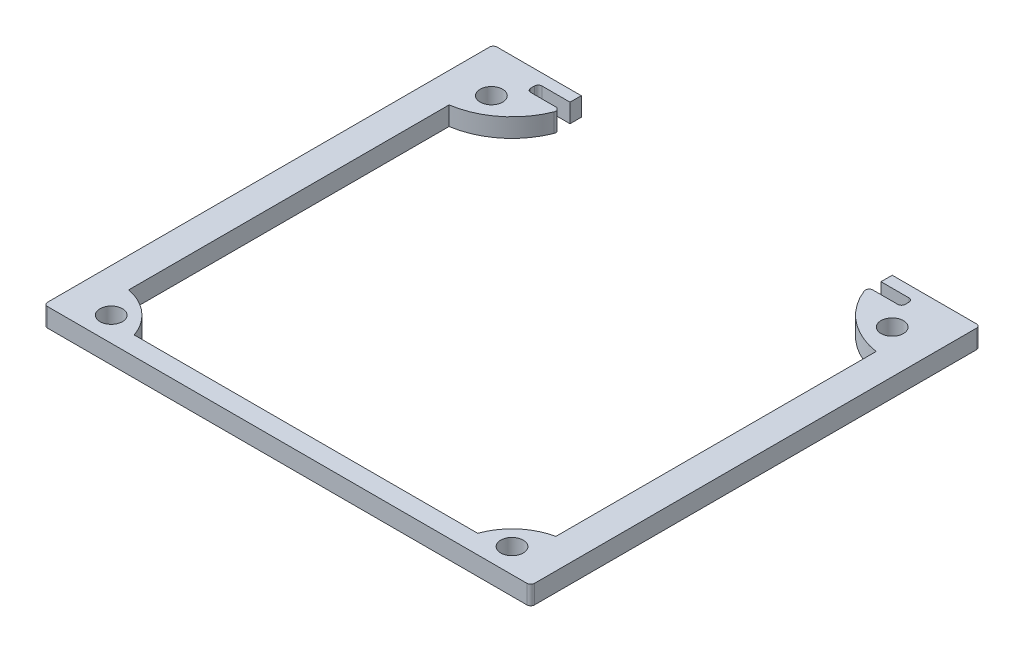
ISO-10303-21;
HEADER;
FILE_DESCRIPTION(('STEP AP214'),'2;1');
FILE_NAME('part.step','',(''),(''),'','','');
FILE_SCHEMA(('AUTOMOTIVE_DESIGN { 1 0 10303 214 1 1 1 1 }'));
ENDSEC;
DATA;
#1=APPLICATION_CONTEXT('core data for automotive mechanical design processes');
#2=APPLICATION_PROTOCOL_DEFINITION('international standard','automotive_design',2000,#1);
#3=PRODUCT_CONTEXT('',#1,'mechanical');
#4=PRODUCT('Part','Part','',(#3));
#5=PRODUCT_RELATED_PRODUCT_CATEGORY('part','',(#4));
#6=PRODUCT_DEFINITION_FORMATION('','',#4);
#7=PRODUCT_DEFINITION_CONTEXT('part definition',#1,'design');
#8=PRODUCT_DEFINITION('design','',#6,#7);
#9=PRODUCT_DEFINITION_SHAPE('','',#8);
#10=(LENGTH_UNIT() NAMED_UNIT(*) SI_UNIT(.MILLI.,.METRE.));
#11=(NAMED_UNIT(*) PLANE_ANGLE_UNIT() SI_UNIT($,.RADIAN.));
#12=(NAMED_UNIT(*) SI_UNIT($,.STERADIAN.) SOLID_ANGLE_UNIT());
#13=UNCERTAINTY_MEASURE_WITH_UNIT(LENGTH_MEASURE(1.E-05),#10,'distance_accuracy_value','');
#14=(GEOMETRIC_REPRESENTATION_CONTEXT(3) GLOBAL_UNCERTAINTY_ASSIGNED_CONTEXT((#13)) GLOBAL_UNIT_ASSIGNED_CONTEXT((#10,
#11,#12)) REPRESENTATION_CONTEXT('',''));
#15=CARTESIAN_POINT('',(0.,0.,0.));
#16=DIRECTION('',(0.,0.,1.));
#17=DIRECTION('',(1.,0.,0.));
#18=AXIS2_PLACEMENT_3D('',#15,#16,#17);
#19=CARTESIAN_POINT('',(125.,5.,-120.));
#20=DIRECTION('',(0.,0.,1.));
#21=DIRECTION('',(1.,0.,0.));
#22=AXIS2_PLACEMENT_3D('',#19,#20,#21);
#23=PLANE('',#22);
#24=DIRECTION('',(-1.,0.,0.));
#25=VECTOR('',#24,1.);
#26=CARTESIAN_POINT('',(125.,0.,-120.));
#27=LINE('',#26,#25);
#28=CARTESIAN_POINT('',(18.4906919245242,0.,-120.));
#29=VERTEX_POINT('',#28);
#30=CARTESIAN_POINT('',(-3.99999999999999,0.,-120.));
#31=VERTEX_POINT('',#30);
#32=EDGE_CURVE('E397',#29,#31,#27,.T.);
#33=ORIENTED_EDGE('',*,*,#32,.T.);
#34=DIRECTION('',(0.,-1.,0.));
#35=VECTOR('',#34,1.);
#36=CARTESIAN_POINT('',(-3.99999999999999,5.,-120.));
#37=LINE('',#36,#35);
#38=CARTESIAN_POINT('',(-3.99999999999999,5.,-120.));
#39=VERTEX_POINT('',#38);
#40=EDGE_CURVE('E11',#31,#39,#37,.F.);
#41=ORIENTED_EDGE('',*,*,#40,.T.);
#42=DIRECTION('',(-1.,0.,0.));
#43=VECTOR('',#42,1.);
#44=CARTESIAN_POINT('',(125.,5.,-120.));
#45=LINE('',#44,#43);
#46=CARTESIAN_POINT('',(18.4906919245242,5.,-120.));
#47=VERTEX_POINT('',#46);
#48=EDGE_CURVE('E405',#47,#39,#45,.T.);
#49=ORIENTED_EDGE('',*,*,#48,.F.);
#50=DIRECTION('',(0.,1.,0.));
#51=VECTOR('',#50,1.);
#52=CARTESIAN_POINT('',(18.4906919245242,-5.,-120.));
#53=LINE('',#52,#51);
#54=EDGE_CURVE('E289',#29,#47,#53,.T.);
#55=ORIENTED_EDGE('',*,*,#54,.F.);
#56=EDGE_LOOP('',(#33,#41,#49,#55));
#57=FACE_BOUND('',#56,.T.);
#58=ADVANCED_FACE('F39',(#57),#23,.F.);
#59=CARTESIAN_POINT('',(9.99999999999999,-5.,-117.));
#60=DIRECTION('',(0.,0.,-1.));
#61=DIRECTION('',(-1.,0.,0.));
#62=AXIS2_PLACEMENT_3D('',#59,#60,#61);
#63=PLANE('',#62);
#64=DIRECTION('',(-1.,0.,0.));
#65=VECTOR('',#64,1.);
#66=CARTESIAN_POINT('',(0.,0.,-117.));
#67=LINE('',#66,#65);
#68=CARTESIAN_POINT('',(18.4906919245242,0.,-117.));
#69=VERTEX_POINT('',#68);
#70=CARTESIAN_POINT('',(11.,0.,-117.));
#71=VERTEX_POINT('',#70);
#72=EDGE_CURVE('E432',#69,#71,#67,.T.);
#73=ORIENTED_EDGE('',*,*,#72,.F.);
#74=DIRECTION('',(0.,1.,0.));
#75=VECTOR('',#74,1.);
#76=CARTESIAN_POINT('',(18.4906919245242,-5.,-117.));
#77=LINE('',#76,#75);
#78=CARTESIAN_POINT('',(18.4906919245242,5.,-117.));
#79=VERTEX_POINT('',#78);
#80=EDGE_CURVE('E303',#69,#79,#77,.T.);
#81=ORIENTED_EDGE('',*,*,#80,.T.);
#82=DIRECTION('',(-1.,0.,0.));
#83=VECTOR('',#82,1.);
#84=CARTESIAN_POINT('',(9.99999999999999,5.,-117.));
#85=LINE('',#84,#83);
#86=CARTESIAN_POINT('',(11.,5.,-117.));
#87=VERTEX_POINT('',#86);
#88=EDGE_CURVE('E324',#79,#87,#85,.T.);
#89=ORIENTED_EDGE('',*,*,#88,.T.);
#90=DIRECTION('',(0.,1.,0.));
#91=VECTOR('',#90,1.);
#92=CARTESIAN_POINT('',(11.,0.,-117.));
#93=LINE('',#92,#91);
#94=EDGE_CURVE('E452',#87,#71,#93,.F.);
#95=ORIENTED_EDGE('',*,*,#94,.T.);
#96=EDGE_LOOP('',(#73,#81,#89,#95));
#97=FACE_BOUND('',#96,.T.);
#98=ADVANCED_FACE('F637',(#97),#63,.F.);
#99=CARTESIAN_POINT('',(0.,5.,0.));
#100=DIRECTION('',(0.,1.,0.));
#101=DIRECTION('',(0.,0.,1.));
#102=AXIS2_PLACEMENT_3D('',#99,#100,#101);
#103=PLANE('',#102);
#104=DIRECTION('',(0.,0.,-1.));
#105=VECTOR('',#104,1.);
#106=CARTESIAN_POINT('',(125.,5.,-120.));
#107=LINE('',#106,#105);
#108=CARTESIAN_POINT('',(125.,5.,-1.));
#109=VERTEX_POINT('',#108);
#110=CARTESIAN_POINT('',(125.,5.,-119.));
#111=VERTEX_POINT('',#110);
#112=EDGE_CURVE('E411',#109,#111,#107,.T.);
#113=ORIENTED_EDGE('',*,*,#112,.T.);
#114=CARTESIAN_POINT('',(124.,5.,-119.));
#115=DIRECTION('',(0.,1.,0.));
#116=DIRECTION('',(0.,0.,1.));
#117=AXIS2_PLACEMENT_3D('',#114,#115,#116);
#118=CIRCLE('',#117,1.);
#119=CARTESIAN_POINT('',(124.,5.,-120.));
#120=VERTEX_POINT('',#119);
#121=EDGE_CURVE('E555',#111,#120,#118,.T.);
#122=ORIENTED_EDGE('',*,*,#121,.T.);
#123=CARTESIAN_POINT('',(101.509308075476,5.,-120.));
#124=VERTEX_POINT('',#123);
#125=EDGE_CURVE('E401',#120,#124,#45,.T.);
#126=ORIENTED_EDGE('',*,*,#125,.T.);
#127=DIRECTION('',(0.,0.,-1.));
#128=VECTOR('',#127,1.);
#129=CARTESIAN_POINT('',(101.509308075476,5.,-113.561951486949));
#130=LINE('',#129,#128);
#131=CARTESIAN_POINT('',(101.509308075476,5.,-117.));
#132=VERTEX_POINT('',#131);
#133=EDGE_CURVE('E281',#132,#124,#130,.T.);
#134=ORIENTED_EDGE('',*,*,#133,.F.);
#135=CARTESIAN_POINT('',(109.,5.,-117.));
#136=VERTEX_POINT('',#135);
#137=EDGE_CURVE('E325',#136,#132,#85,.T.);
#138=ORIENTED_EDGE('',*,*,#137,.F.);
#139=CARTESIAN_POINT('',(109.,5.,-116.));
#140=DIRECTION('',(0.,1.,0.));
#141=DIRECTION('',(0.,0.,1.));
#142=AXIS2_PLACEMENT_3D('',#139,#140,#141);
#143=CIRCLE('',#142,1.);
#144=CARTESIAN_POINT('',(110.,5.,-116.));
#145=VERTEX_POINT('',#144);
#146=EDGE_CURVE('E478',#136,#145,#143,.F.);
#147=ORIENTED_EDGE('',*,*,#146,.T.);
#148=DIRECTION('',(0.,0.,-1.));
#149=VECTOR('',#148,1.);
#150=CARTESIAN_POINT('',(110.,5.,-114.));
#151=LINE('',#150,#149);
#152=CARTESIAN_POINT('',(110.,5.,-115.));
#153=VERTEX_POINT('',#152);
#154=EDGE_CURVE('E320',#153,#145,#151,.T.);
#155=ORIENTED_EDGE('',*,*,#154,.F.);
#156=CARTESIAN_POINT('',(109.,5.,-115.));
#157=DIRECTION('',(0.,1.,0.));
#158=DIRECTION('',(0.,0.,1.));
#159=AXIS2_PLACEMENT_3D('',#156,#157,#158);
#160=CIRCLE('',#159,1.);
#161=CARTESIAN_POINT('',(109.,5.,-114.));
#162=VERTEX_POINT('',#161);
#163=EDGE_CURVE('E484',#153,#162,#160,.F.);
#164=ORIENTED_EDGE('',*,*,#163,.T.);
#165=DIRECTION('',(1.,0.,0.));
#166=VECTOR('',#165,1.);
#167=CARTESIAN_POINT('',(9.99999999999999,5.,-114.));
#168=LINE('',#167,#166);
#169=CARTESIAN_POINT('',(102.336478267344,5.,-114.));
#170=VERTEX_POINT('',#169);
#171=EDGE_CURVE('E315',#170,#162,#168,.T.);
#172=ORIENTED_EDGE('',*,*,#171,.F.);
#173=CARTESIAN_POINT('',(102.336478267344,5.,-113.));
#174=DIRECTION('',(0.,1.,0.));
#175=DIRECTION('',(0.,0.,1.));
#176=AXIS2_PLACEMENT_3D('',#173,#174,#175);
#177=CIRCLE('',#176,1.);
#178=CARTESIAN_POINT('',(101.406819228783,5.,-112.631578947368));
#179=VERTEX_POINT('',#178);
#180=EDGE_CURVE('E246',#170,#179,#177,.T.);
#181=ORIENTED_EDGE('',*,*,#180,.T.);
#182=CARTESIAN_POINT('',(120.,5.,-120.));
#183=DIRECTION('',(0.,-1.,0.));
#184=DIRECTION('',(0.,0.,1.));
#185=AXIS2_PLACEMENT_3D('',#182,#183,#184);
#186=CIRCLE('',#185,20.);
#187=CARTESIAN_POINT('',(117.,5.,-100.226280066715));
#188=VERTEX_POINT('',#187);
#189=EDGE_CURVE('E237',#188,#179,#186,.T.);
#190=ORIENTED_EDGE('',*,*,#189,.F.);
#191=DIRECTION('',(0.,0.,1.));
#192=VECTOR('',#191,1.);
#193=CARTESIAN_POINT('',(117.,5.,-103.567500750222));
#194=LINE('',#193,#192);
#195=CARTESIAN_POINT('',(117.,5.,-14.6969384566991));
#196=VERTEX_POINT('',#195);
#197=EDGE_CURVE('E244',#188,#196,#194,.T.);
#198=ORIENTED_EDGE('',*,*,#197,.T.);
#199=CARTESIAN_POINT('',(120.,5.,0.));
#200=DIRECTION('',(0.,-1.,0.));
#201=DIRECTION('',(0.,0.,-1.));
#202=AXIS2_PLACEMENT_3D('',#199,#200,#201);
#203=CIRCLE('',#202,15.);
#204=CARTESIAN_POINT('',(105.857864376269,5.,-5.));
#205=VERTEX_POINT('',#204);
#206=EDGE_CURVE('E252',#205,#196,#203,.T.);
#207=ORIENTED_EDGE('',*,*,#206,.F.);
#208=DIRECTION('',(1.,0.,0.));
#209=VECTOR('',#208,1.);
#210=CARTESIAN_POINT('',(15.,5.,-5.));
#211=LINE('',#210,#209);
#212=CARTESIAN_POINT('',(14.142135623731,5.,-5.));
#213=VERTEX_POINT('',#212);
#214=EDGE_CURVE('E354',#213,#205,#211,.T.);
#215=ORIENTED_EDGE('',*,*,#214,.F.);
#216=CARTESIAN_POINT('',(0.,5.,0.));
#217=DIRECTION('',(0.,-1.,0.));
#218=DIRECTION('',(0.,0.,1.));
#219=AXIS2_PLACEMENT_3D('',#216,#217,#218);
#220=CIRCLE('',#219,15.);
#221=CARTESIAN_POINT('',(2.97983416543105,5.,-14.7010403831338));
#222=VERTEX_POINT('',#221);
#223=EDGE_CURVE('E351',#222,#213,#220,.T.);
#224=ORIENTED_EDGE('',*,*,#223,.F.);
#225=DIRECTION('',(0.,0.,-1.));
#226=VECTOR('',#225,1.);
#227=CARTESIAN_POINT('',(2.97983416543105,5.,-11.5593706947354));
#228=LINE('',#227,#226);
#229=CARTESIAN_POINT('',(2.97983416543105,5.,-100.223231094374));
#230=VERTEX_POINT('',#229);
#231=EDGE_CURVE('E276',#222,#230,#228,.T.);
#232=ORIENTED_EDGE('',*,*,#231,.T.);
#233=CARTESIAN_POINT('',(0.,5.,-120.));
#234=DIRECTION('',(0.,-1.,0.));
#235=DIRECTION('',(0.,0.,-1.));
#236=AXIS2_PLACEMENT_3D('',#233,#234,#235);
#237=CIRCLE('',#236,20.);
#238=CARTESIAN_POINT('',(18.5931807712165,5.,-112.631578947368));
#239=VERTEX_POINT('',#238);
#240=EDGE_CURVE('E251',#239,#230,#237,.T.);
#241=ORIENTED_EDGE('',*,*,#240,.F.);
#242=CARTESIAN_POINT('',(17.6635217326557,5.,-113.));
#243=DIRECTION('',(0.,1.,0.));
#244=DIRECTION('',(0.,0.,1.));
#245=AXIS2_PLACEMENT_3D('',#242,#243,#244);
#246=CIRCLE('',#245,1.);
#247=CARTESIAN_POINT('',(17.6635217326557,5.,-114.));
#248=VERTEX_POINT('',#247);
#249=EDGE_CURVE('E507',#239,#248,#246,.T.);
#250=ORIENTED_EDGE('',*,*,#249,.T.);
#251=CARTESIAN_POINT('',(11.,5.,-114.));
#252=VERTEX_POINT('',#251);
#253=EDGE_CURVE('E316',#252,#248,#168,.T.);
#254=ORIENTED_EDGE('',*,*,#253,.F.);
#255=CARTESIAN_POINT('',(11.,5.,-115.));
#256=DIRECTION('',(0.,1.,0.));
#257=DIRECTION('',(0.,0.,1.));
#258=AXIS2_PLACEMENT_3D('',#255,#256,#257);
#259=CIRCLE('',#258,1.);
#260=CARTESIAN_POINT('',(9.99999999999999,5.,-115.));
#261=VERTEX_POINT('',#260);
#262=EDGE_CURVE('E491',#252,#261,#259,.F.);
#263=ORIENTED_EDGE('',*,*,#262,.T.);
#264=DIRECTION('',(0.,0.,1.));
#265=VECTOR('',#264,1.);
#266=CARTESIAN_POINT('',(9.99999999999999,5.,-114.));
#267=LINE('',#266,#265);
#268=CARTESIAN_POINT('',(9.99999999999999,5.,-116.));
#269=VERTEX_POINT('',#268);
#270=EDGE_CURVE('E311',#269,#261,#267,.T.);
#271=ORIENTED_EDGE('',*,*,#270,.F.);
#272=CARTESIAN_POINT('',(11.,5.,-116.));
#273=DIRECTION('',(0.,1.,0.));
#274=DIRECTION('',(0.,0.,1.));
#275=AXIS2_PLACEMENT_3D('',#272,#273,#274);
#276=CIRCLE('',#275,1.);
#277=EDGE_CURVE('E471',#269,#87,#276,.F.);
#278=ORIENTED_EDGE('',*,*,#277,.T.);
#279=ORIENTED_EDGE('',*,*,#88,.F.);
#280=DIRECTION('',(0.,0.,1.));
#281=VECTOR('',#280,1.);
#282=CARTESIAN_POINT('',(18.4906919245242,5.,-113.561951486949));
#283=LINE('',#282,#281);
#284=EDGE_CURVE('E285',#47,#79,#283,.T.);
#285=ORIENTED_EDGE('',*,*,#284,.F.);
#286=ORIENTED_EDGE('',*,*,#48,.T.);
#287=CARTESIAN_POINT('',(-4.,5.,-119.));
#288=DIRECTION('',(0.,1.,0.));
#289=DIRECTION('',(0.,0.,1.));
#290=AXIS2_PLACEMENT_3D('',#287,#288,#289);
#291=CIRCLE('',#290,1.);
#292=CARTESIAN_POINT('',(-5.,5.,-119.));
#293=VERTEX_POINT('',#292);
#294=EDGE_CURVE('E549',#39,#293,#291,.T.);
#295=ORIENTED_EDGE('',*,*,#294,.T.);
#296=DIRECTION('',(0.,0.,1.));
#297=VECTOR('',#296,1.);
#298=CARTESIAN_POINT('',(-5.,5.,-120.));
#299=LINE('',#298,#297);
#300=CARTESIAN_POINT('',(-4.99999999999999,5.,-1.));
#301=VERTEX_POINT('',#300);
#302=EDGE_CURVE('E404',#293,#301,#299,.T.);
#303=ORIENTED_EDGE('',*,*,#302,.T.);
#304=CARTESIAN_POINT('',(-3.99999999999999,5.,-1.));
#305=DIRECTION('',(0.,1.,0.));
#306=DIRECTION('',(0.,0.,1.));
#307=AXIS2_PLACEMENT_3D('',#304,#305,#306);
#308=CIRCLE('',#307,1.);
#309=CARTESIAN_POINT('',(-3.99999999999999,5.,0.));
#310=VERTEX_POINT('',#309);
#311=EDGE_CURVE('E62',#301,#310,#308,.T.);
#312=ORIENTED_EDGE('',*,*,#311,.T.);
#313=DIRECTION('',(1.,0.,0.));
#314=VECTOR('',#313,1.);
#315=CARTESIAN_POINT('',(-4.99999999999999,5.,0.));
#316=LINE('',#315,#314);
#317=CARTESIAN_POINT('',(124.,5.,0.));
#318=VERTEX_POINT('',#317);
#319=EDGE_CURVE('E408',#310,#318,#316,.T.);
#320=ORIENTED_EDGE('',*,*,#319,.T.);
#321=CARTESIAN_POINT('',(124.,5.,-1.));
#322=DIRECTION('',(0.,1.,0.));
#323=DIRECTION('',(0.,0.,1.));
#324=AXIS2_PLACEMENT_3D('',#321,#322,#323);
#325=CIRCLE('',#324,1.);
#326=EDGE_CURVE('E552',#318,#109,#325,.T.);
#327=ORIENTED_EDGE('',*,*,#326,.T.);
#328=EDGE_LOOP('',(#113,#122,#126,#134,#138,#147,#155,#164,#172,#181,#190,#198,#207,#215,#224,
#232,#241,#250,#254,#263,#271,#278,#279,#285,#286,#295,#303,#312,#320,#327));
#329=FACE_BOUND('',#328,.T.);
#330=CARTESIAN_POINT('',(6.5,5.,-108.));
#331=DIRECTION('',(0.,1.,0.));
#332=DIRECTION('',(0.,0.,1.));
#333=AXIS2_PLACEMENT_3D('',#330,#331,#332);
#334=CIRCLE('',#333,3.);
#335=CARTESIAN_POINT('',(6.5,5.,-105.));
#336=VERTEX_POINT('',#335);
#337=EDGE_CURVE('E343',#336,#336,#334,.T.);
#338=ORIENTED_EDGE('',*,*,#337,.F.);
#339=EDGE_LOOP('',(#338));
#340=FACE_BOUND('',#339,.T.);
#341=CARTESIAN_POINT('',(6.5,5.,-6.5));
#342=DIRECTION('',(0.,1.,0.));
#343=DIRECTION('',(0.,0.,1.));
#344=AXIS2_PLACEMENT_3D('',#341,#342,#343);
#345=CIRCLE('',#344,3.);
#346=CARTESIAN_POINT('',(6.5,5.,-3.5));
#347=VERTEX_POINT('',#346);
#348=EDGE_CURVE('E393',#347,#347,#345,.T.);
#349=ORIENTED_EDGE('',*,*,#348,.F.);
#350=EDGE_LOOP('',(#349));
#351=FACE_BOUND('',#350,.T.);
#352=CARTESIAN_POINT('',(113.5,5.,-6.5));
#353=DIRECTION('',(0.,1.,0.));
#354=DIRECTION('',(0.,0.,1.));
#355=AXIS2_PLACEMENT_3D('',#352,#353,#354);
#356=CIRCLE('',#355,3.00000000000001);
#357=CARTESIAN_POINT('',(113.5,5.,-3.49999999999999));
#358=VERTEX_POINT('',#357);
#359=EDGE_CURVE('E385',#358,#358,#356,.T.);
#360=ORIENTED_EDGE('',*,*,#359,.F.);
#361=EDGE_LOOP('',(#360));
#362=FACE_BOUND('',#361,.T.);
#363=CARTESIAN_POINT('',(113.5,5.,-108.));
#364=DIRECTION('',(0.,1.,0.));
#365=DIRECTION('',(0.,0.,1.));
#366=AXIS2_PLACEMENT_3D('',#363,#364,#365);
#367=CIRCLE('',#366,3.00000000000001);
#368=CARTESIAN_POINT('',(113.5,5.,-105.));
#369=VERTEX_POINT('',#368);
#370=EDGE_CURVE('E334',#369,#369,#367,.T.);
#371=ORIENTED_EDGE('',*,*,#370,.F.);
#372=EDGE_LOOP('',(#371));
#373=FACE_BOUND('',#372,.T.);
#374=ADVANCED_FACE('F240',(#329,#340,#351,#362,#373),#103,.T.);
#375=CARTESIAN_POINT('',(0.,0.,0.));
#376=DIRECTION('',(0.,1.,0.));
#377=DIRECTION('',(0.,0.,1.));
#378=AXIS2_PLACEMENT_3D('',#375,#376,#377);
#379=PLANE('',#378);
#380=CARTESIAN_POINT('',(124.,0.,-120.));
#381=VERTEX_POINT('',#380);
#382=CARTESIAN_POINT('',(101.509308075476,0.,-120.));
#383=VERTEX_POINT('',#382);
#384=EDGE_CURVE('E415',#381,#383,#27,.T.);
#385=ORIENTED_EDGE('',*,*,#384,.F.);
#386=CARTESIAN_POINT('',(124.,0.,-119.));
#387=DIRECTION('',(0.,1.,0.));
#388=DIRECTION('',(0.,0.,1.));
#389=AXIS2_PLACEMENT_3D('',#386,#387,#388);
#390=CIRCLE('',#389,1.);
#391=CARTESIAN_POINT('',(125.,0.,-119.));
#392=VERTEX_POINT('',#391);
#393=EDGE_CURVE('E537',#381,#392,#390,.F.);
#394=ORIENTED_EDGE('',*,*,#393,.T.);
#395=DIRECTION('',(0.,0.,-1.));
#396=VECTOR('',#395,1.);
#397=CARTESIAN_POINT('',(125.,0.,-120.));
#398=LINE('',#397,#396);
#399=CARTESIAN_POINT('',(125.,0.,-1.));
#400=VERTEX_POINT('',#399);
#401=EDGE_CURVE('E425',#400,#392,#398,.T.);
#402=ORIENTED_EDGE('',*,*,#401,.F.);
#403=CARTESIAN_POINT('',(124.,0.,-1.));
#404=DIRECTION('',(0.,1.,0.));
#405=DIRECTION('',(0.,0.,1.));
#406=AXIS2_PLACEMENT_3D('',#403,#404,#405);
#407=CIRCLE('',#406,1.);
#408=CARTESIAN_POINT('',(124.,0.,0.));
#409=VERTEX_POINT('',#408);
#410=EDGE_CURVE('E534',#400,#409,#407,.F.);
#411=ORIENTED_EDGE('',*,*,#410,.T.);
#412=DIRECTION('',(1.,0.,0.));
#413=VECTOR('',#412,1.);
#414=CARTESIAN_POINT('',(-4.99999999999999,0.,0.));
#415=LINE('',#414,#413);
#416=CARTESIAN_POINT('',(-3.99999999999999,0.,0.));
#417=VERTEX_POINT('',#416);
#418=EDGE_CURVE('E422',#417,#409,#415,.T.);
#419=ORIENTED_EDGE('',*,*,#418,.F.);
#420=CARTESIAN_POINT('',(-3.99999999999999,0.,-1.));
#421=DIRECTION('',(0.,1.,0.));
#422=DIRECTION('',(0.,0.,1.));
#423=AXIS2_PLACEMENT_3D('',#420,#421,#422);
#424=CIRCLE('',#423,1.);
#425=CARTESIAN_POINT('',(-4.99999999999999,0.,-1.));
#426=VERTEX_POINT('',#425);
#427=EDGE_CURVE('E528',#417,#426,#424,.F.);
#428=ORIENTED_EDGE('',*,*,#427,.T.);
#429=DIRECTION('',(0.,0.,1.));
#430=VECTOR('',#429,1.);
#431=CARTESIAN_POINT('',(-5.,0.,-120.));
#432=LINE('',#431,#430);
#433=CARTESIAN_POINT('',(-5.,0.,-119.));
#434=VERTEX_POINT('',#433);
#435=EDGE_CURVE('E418',#434,#426,#432,.T.);
#436=ORIENTED_EDGE('',*,*,#435,.F.);
#437=CARTESIAN_POINT('',(-4.,0.,-119.));
#438=DIRECTION('',(0.,1.,0.));
#439=DIRECTION('',(0.,0.,1.));
#440=AXIS2_PLACEMENT_3D('',#437,#438,#439);
#441=CIRCLE('',#440,1.);
#442=EDGE_CURVE('E531',#434,#31,#441,.F.);
#443=ORIENTED_EDGE('',*,*,#442,.T.);
#444=ORIENTED_EDGE('',*,*,#32,.F.);
#445=DIRECTION('',(0.,0.,1.));
#446=VECTOR('',#445,1.);
#447=CARTESIAN_POINT('',(18.4906919245243,0.,0.));
#448=LINE('',#447,#446);
#449=EDGE_CURVE('E307',#29,#69,#448,.T.);
#450=ORIENTED_EDGE('',*,*,#449,.T.);
#451=ORIENTED_EDGE('',*,*,#72,.T.);
#452=CARTESIAN_POINT('',(11.,0.,-116.));
#453=DIRECTION('',(0.,1.,0.));
#454=DIRECTION('',(0.,0.,1.));
#455=AXIS2_PLACEMENT_3D('',#452,#453,#454);
#456=CIRCLE('',#455,1.);
#457=CARTESIAN_POINT('',(9.99999999999999,0.,-116.));
#458=VERTEX_POINT('',#457);
#459=EDGE_CURVE('E475',#71,#458,#456,.T.);
#460=ORIENTED_EDGE('',*,*,#459,.T.);
#461=DIRECTION('',(0.,0.,1.));
#462=VECTOR('',#461,1.);
#463=CARTESIAN_POINT('',(9.99999999999999,0.,0.));
#464=LINE('',#463,#462);
#465=CARTESIAN_POINT('',(9.99999999999999,0.,-115.));
#466=VERTEX_POINT('',#465);
#467=EDGE_CURVE('E437',#458,#466,#464,.T.);
#468=ORIENTED_EDGE('',*,*,#467,.T.);
#469=CARTESIAN_POINT('',(11.,0.,-115.));
#470=DIRECTION('',(0.,1.,0.));
#471=DIRECTION('',(0.,0.,1.));
#472=AXIS2_PLACEMENT_3D('',#469,#470,#471);
#473=CIRCLE('',#472,1.);
#474=CARTESIAN_POINT('',(11.,0.,-114.));
#475=VERTEX_POINT('',#474);
#476=EDGE_CURVE('E494',#466,#475,#473,.T.);
#477=ORIENTED_EDGE('',*,*,#476,.T.);
#478=DIRECTION('',(1.,0.,0.));
#479=VECTOR('',#478,1.);
#480=CARTESIAN_POINT('',(0.,0.,-114.));
#481=LINE('',#480,#479);
#482=CARTESIAN_POINT('',(17.6635217326557,0.,-114.));
#483=VERTEX_POINT('',#482);
#484=EDGE_CURVE('E329',#475,#483,#481,.T.);
#485=ORIENTED_EDGE('',*,*,#484,.T.);
#486=CARTESIAN_POINT('',(17.6635217326557,0.,-113.));
#487=DIRECTION('',(0.,1.,0.));
#488=DIRECTION('',(0.,0.,1.));
#489=AXIS2_PLACEMENT_3D('',#486,#487,#488);
#490=CIRCLE('',#489,1.);
#491=CARTESIAN_POINT('',(18.5931807712165,0.,-112.631578947368));
#492=VERTEX_POINT('',#491);
#493=EDGE_CURVE('E501',#483,#492,#490,.F.);
#494=ORIENTED_EDGE('',*,*,#493,.T.);
#495=CARTESIAN_POINT('',(0.,0.,-120.));
#496=DIRECTION('',(0.,-1.,0.));
#497=DIRECTION('',(0.,0.,-1.));
#498=AXIS2_PLACEMENT_3D('',#495,#496,#497);
#499=CIRCLE('',#498,20.);
#500=CARTESIAN_POINT('',(2.97983416543105,0.,-100.223231094374));
#501=VERTEX_POINT('',#500);
#502=EDGE_CURVE('E355',#492,#501,#499,.T.);
#503=ORIENTED_EDGE('',*,*,#502,.T.);
#504=DIRECTION('',(0.,0.,-1.));
#505=VECTOR('',#504,1.);
#506=CARTESIAN_POINT('',(2.97983416543105,0.,-11.5593706947354));
#507=LINE('',#506,#505);
#508=CARTESIAN_POINT('',(2.97983416543105,0.,-14.7010403831338));
#509=VERTEX_POINT('',#508);
#510=EDGE_CURVE('E670',#509,#501,#507,.T.);
#511=ORIENTED_EDGE('',*,*,#510,.F.);
#512=CARTESIAN_POINT('',(0.,0.,0.));
#513=DIRECTION('',(0.,-1.,0.));
#514=DIRECTION('',(0.,0.,1.));
#515=AXIS2_PLACEMENT_3D('',#512,#513,#514);
#516=CIRCLE('',#515,15.);
#517=CARTESIAN_POINT('',(14.142135623731,0.,-5.));
#518=VERTEX_POINT('',#517);
#519=EDGE_CURVE('E347',#509,#518,#516,.T.);
#520=ORIENTED_EDGE('',*,*,#519,.T.);
#521=DIRECTION('',(1.,0.,0.));
#522=VECTOR('',#521,1.);
#523=CARTESIAN_POINT('',(105.,0.,-5.));
#524=LINE('',#523,#522);
#525=CARTESIAN_POINT('',(105.857864376269,0.,-5.));
#526=VERTEX_POINT('',#525);
#527=EDGE_CURVE('E365',#518,#526,#524,.T.);
#528=ORIENTED_EDGE('',*,*,#527,.T.);
#529=CARTESIAN_POINT('',(120.,0.,0.));
#530=DIRECTION('',(0.,-1.,0.));
#531=DIRECTION('',(0.,0.,-1.));
#532=AXIS2_PLACEMENT_3D('',#529,#530,#531);
#533=CIRCLE('',#532,15.);
#534=CARTESIAN_POINT('',(117.,0.,-14.6969384566991));
#535=VERTEX_POINT('',#534);
#536=EDGE_CURVE('E369',#526,#535,#533,.T.);
#537=ORIENTED_EDGE('',*,*,#536,.T.);
#538=DIRECTION('',(0.,0.,1.));
#539=VECTOR('',#538,1.);
#540=CARTESIAN_POINT('',(117.,0.,-103.567500750222));
#541=LINE('',#540,#539);
#542=CARTESIAN_POINT('',(117.,0.,-100.226280066715));
#543=VERTEX_POINT('',#542);
#544=EDGE_CURVE('E269',#543,#535,#541,.T.);
#545=ORIENTED_EDGE('',*,*,#544,.F.);
#546=CARTESIAN_POINT('',(120.,0.,-120.));
#547=DIRECTION('',(0.,-1.,0.));
#548=DIRECTION('',(0.,0.,1.));
#549=AXIS2_PLACEMENT_3D('',#546,#547,#548);
#550=CIRCLE('',#549,20.);
#551=CARTESIAN_POINT('',(101.406819228783,0.,-112.631578947368));
#552=VERTEX_POINT('',#551);
#553=EDGE_CURVE('E257',#543,#552,#550,.T.);
#554=ORIENTED_EDGE('',*,*,#553,.T.);
#555=CARTESIAN_POINT('',(102.336478267344,0.,-113.));
#556=DIRECTION('',(0.,1.,0.));
#557=DIRECTION('',(0.,0.,1.));
#558=AXIS2_PLACEMENT_3D('',#555,#556,#557);
#559=CIRCLE('',#558,1.);
#560=CARTESIAN_POINT('',(102.336478267344,0.,-114.));
#561=VERTEX_POINT('',#560);
#562=EDGE_CURVE('E263',#552,#561,#559,.F.);
#563=ORIENTED_EDGE('',*,*,#562,.T.);
#564=CARTESIAN_POINT('',(109.,0.,-114.));
#565=VERTEX_POINT('',#564);
#566=EDGE_CURVE('E333',#561,#565,#481,.T.);
#567=ORIENTED_EDGE('',*,*,#566,.T.);
#568=CARTESIAN_POINT('',(109.,0.,-115.));
#569=DIRECTION('',(0.,1.,0.));
#570=DIRECTION('',(0.,0.,1.));
#571=AXIS2_PLACEMENT_3D('',#568,#569,#570);
#572=CIRCLE('',#571,1.);
#573=CARTESIAN_POINT('',(110.,0.,-115.));
#574=VERTEX_POINT('',#573);
#575=EDGE_CURVE('E488',#565,#574,#572,.T.);
#576=ORIENTED_EDGE('',*,*,#575,.T.);
#577=DIRECTION('',(0.,0.,-1.));
#578=VECTOR('',#577,1.);
#579=CARTESIAN_POINT('',(110.,0.,0.));
#580=LINE('',#579,#578);
#581=CARTESIAN_POINT('',(110.,0.,-116.));
#582=VERTEX_POINT('',#581);
#583=EDGE_CURVE('E414',#574,#582,#580,.T.);
#584=ORIENTED_EDGE('',*,*,#583,.T.);
#585=CARTESIAN_POINT('',(109.,0.,-116.));
#586=DIRECTION('',(0.,1.,0.));
#587=DIRECTION('',(0.,0.,1.));
#588=AXIS2_PLACEMENT_3D('',#585,#586,#587);
#589=CIRCLE('',#588,1.);
#590=CARTESIAN_POINT('',(109.,0.,-117.));
#591=VERTEX_POINT('',#590);
#592=EDGE_CURVE('E481',#582,#591,#589,.T.);
#593=ORIENTED_EDGE('',*,*,#592,.T.);
#594=CARTESIAN_POINT('',(101.509308075476,0.,-117.));
#595=VERTEX_POINT('',#594);
#596=EDGE_CURVE('E433',#591,#595,#67,.T.);
#597=ORIENTED_EDGE('',*,*,#596,.T.);
#598=DIRECTION('',(0.,0.,-1.));
#599=VECTOR('',#598,1.);
#600=CARTESIAN_POINT('',(101.509308075476,0.,0.));
#601=LINE('',#600,#599);
#602=EDGE_CURVE('E299',#595,#383,#601,.T.);
#603=ORIENTED_EDGE('',*,*,#602,.T.);
#604=EDGE_LOOP('',(#385,#394,#402,#411,#419,#428,#436,#443,#444,#450,#451,#460,#468,#477,#485,
#494,#503,#511,#520,#528,#537,#545,#554,#563,#567,#576,#584,#593,#597,#603));
#605=FACE_BOUND('',#604,.T.);
#606=CARTESIAN_POINT('',(113.5,0.,-6.5));
#607=DIRECTION('',(0.,1.,0.));
#608=DIRECTION('',(0.,0.,1.));
#609=AXIS2_PLACEMENT_3D('',#606,#607,#608);
#610=CIRCLE('',#609,3.00000000000001);
#611=CARTESIAN_POINT('',(113.5,0.,-3.49999999999999));
#612=VERTEX_POINT('',#611);
#613=EDGE_CURVE('E384',#612,#612,#610,.T.);
#614=ORIENTED_EDGE('',*,*,#613,.T.);
#615=EDGE_LOOP('',(#614));
#616=FACE_BOUND('',#615,.T.);
#617=CARTESIAN_POINT('',(6.5,0.,-6.5));
#618=DIRECTION('',(0.,1.,0.));
#619=DIRECTION('',(0.,0.,1.));
#620=AXIS2_PLACEMENT_3D('',#617,#618,#619);
#621=CIRCLE('',#620,3.);
#622=CARTESIAN_POINT('',(6.5,0.,-3.5));
#623=VERTEX_POINT('',#622);
#624=EDGE_CURVE('E389',#623,#623,#621,.T.);
#625=ORIENTED_EDGE('',*,*,#624,.T.);
#626=EDGE_LOOP('',(#625));
#627=FACE_BOUND('',#626,.T.);
#628=CARTESIAN_POINT('',(6.5,0.,-108.));
#629=DIRECTION('',(0.,1.,0.));
#630=DIRECTION('',(0.,0.,1.));
#631=AXIS2_PLACEMENT_3D('',#628,#629,#630);
#632=CIRCLE('',#631,3.);
#633=CARTESIAN_POINT('',(6.5,0.,-105.));
#634=VERTEX_POINT('',#633);
#635=EDGE_CURVE('E338',#634,#634,#632,.T.);
#636=ORIENTED_EDGE('',*,*,#635,.T.);
#637=EDGE_LOOP('',(#636));
#638=FACE_BOUND('',#637,.T.);
#639=CARTESIAN_POINT('',(113.5,0.,-108.));
#640=DIRECTION('',(0.,1.,0.));
#641=DIRECTION('',(0.,0.,1.));
#642=AXIS2_PLACEMENT_3D('',#639,#640,#641);
#643=CIRCLE('',#642,3.00000000000001);
#644=CARTESIAN_POINT('',(113.5,0.,-105.));
#645=VERTEX_POINT('',#644);
#646=EDGE_CURVE('E339',#645,#645,#643,.T.);
#647=ORIENTED_EDGE('',*,*,#646,.T.);
#648=EDGE_LOOP('',(#647));
#649=FACE_BOUND('',#648,.T.);
#650=ADVANCED_FACE('F578',(#605,#616,#627,#638,#649),#379,.F.);
#651=ORIENTED_EDGE('',*,*,#125,.F.);
#652=DIRECTION('',(0.,-1.,0.));
#653=VECTOR('',#652,1.);
#654=CARTESIAN_POINT('',(124.,5.,-120.));
#655=LINE('',#654,#653);
#656=EDGE_CURVE('E524',#120,#381,#655,.T.);
#657=ORIENTED_EDGE('',*,*,#656,.T.);
#658=ORIENTED_EDGE('',*,*,#384,.T.);
#659=DIRECTION('',(0.,1.,0.));
#660=VECTOR('',#659,1.);
#661=CARTESIAN_POINT('',(101.509308075476,-5.,-120.));
#662=LINE('',#661,#660);
#663=EDGE_CURVE('E288',#383,#124,#662,.T.);
#664=ORIENTED_EDGE('',*,*,#663,.T.);
#665=EDGE_LOOP('',(#651,#657,#658,#664));
#666=FACE_BOUND('',#665,.T.);
#667=ADVANCED_FACE('F601',(#666),#23,.F.);
#668=CARTESIAN_POINT('',(-5.,5.,-120.));
#669=DIRECTION('',(1.,0.,0.));
#670=DIRECTION('',(0.,0.,-1.));
#671=AXIS2_PLACEMENT_3D('',#668,#669,#670);
#672=PLANE('',#671);
#673=ORIENTED_EDGE('',*,*,#302,.F.);
#674=DIRECTION('',(0.,-1.,0.));
#675=VECTOR('',#674,1.);
#676=CARTESIAN_POINT('',(-5.,5.,-119.));
#677=LINE('',#676,#675);
#678=EDGE_CURVE('E48',#293,#434,#677,.T.);
#679=ORIENTED_EDGE('',*,*,#678,.T.);
#680=ORIENTED_EDGE('',*,*,#435,.T.);
#681=DIRECTION('',(0.,-1.,0.));
#682=VECTOR('',#681,1.);
#683=CARTESIAN_POINT('',(-4.99999999999999,5.,-1.));
#684=LINE('',#683,#682);
#685=EDGE_CURVE('E564',#426,#301,#684,.F.);
#686=ORIENTED_EDGE('',*,*,#685,.T.);
#687=EDGE_LOOP('',(#673,#679,#680,#686));
#688=FACE_BOUND('',#687,.T.);
#689=ADVANCED_FACE('F572',(#688),#672,.F.);
#690=CARTESIAN_POINT('',(-4.99999999999999,5.,0.));
#691=DIRECTION('',(0.,0.,-1.));
#692=DIRECTION('',(-1.,0.,0.));
#693=AXIS2_PLACEMENT_3D('',#690,#691,#692);
#694=PLANE('',#693);
#695=ORIENTED_EDGE('',*,*,#418,.T.);
#696=DIRECTION('',(0.,-1.,0.));
#697=VECTOR('',#696,1.);
#698=CARTESIAN_POINT('',(124.,5.,0.));
#699=LINE('',#698,#697);
#700=EDGE_CURVE('E55',#409,#318,#699,.F.);
#701=ORIENTED_EDGE('',*,*,#700,.T.);
#702=ORIENTED_EDGE('',*,*,#319,.F.);
#703=DIRECTION('',(0.,-1.,0.));
#704=VECTOR('',#703,1.);
#705=CARTESIAN_POINT('',(-3.99999999999999,5.,0.));
#706=LINE('',#705,#704);
#707=EDGE_CURVE('E558',#310,#417,#706,.T.);
#708=ORIENTED_EDGE('',*,*,#707,.T.);
#709=EDGE_LOOP('',(#695,#701,#702,#708));
#710=FACE_BOUND('',#709,.T.);
#711=ADVANCED_FACE('F585',(#710),#694,.F.);
#712=CARTESIAN_POINT('',(125.,5.,-120.));
#713=DIRECTION('',(-1.,0.,0.));
#714=DIRECTION('',(0.,0.,1.));
#715=AXIS2_PLACEMENT_3D('',#712,#713,#714);
#716=PLANE('',#715);
#717=ORIENTED_EDGE('',*,*,#401,.T.);
#718=DIRECTION('',(0.,-1.,0.));
#719=VECTOR('',#718,1.);
#720=CARTESIAN_POINT('',(125.,5.,-119.));
#721=LINE('',#720,#719);
#722=EDGE_CURVE('E544',#392,#111,#721,.F.);
#723=ORIENTED_EDGE('',*,*,#722,.T.);
#724=ORIENTED_EDGE('',*,*,#112,.F.);
#725=DIRECTION('',(0.,-1.,0.));
#726=VECTOR('',#725,1.);
#727=CARTESIAN_POINT('',(125.,5.,-1.));
#728=LINE('',#727,#726);
#729=EDGE_CURVE('E540',#109,#400,#728,.T.);
#730=ORIENTED_EDGE('',*,*,#729,.T.);
#731=EDGE_LOOP('',(#717,#723,#724,#730));
#732=FACE_BOUND('',#731,.T.);
#733=ADVANCED_FACE('F593',(#732),#716,.F.);
#734=CARTESIAN_POINT('',(6.5,5.,-6.5));
#735=DIRECTION('',(0.,-1.,0.));
#736=DIRECTION('',(0.,0.,-1.));
#737=AXIS2_PLACEMENT_3D('',#734,#735,#736);
#738=CYLINDRICAL_SURFACE('',#737,3.);
#739=ORIENTED_EDGE('',*,*,#348,.T.);
#740=EDGE_LOOP('',(#739));
#741=FACE_BOUND('',#740,.T.);
#742=ORIENTED_EDGE('',*,*,#624,.F.);
#743=EDGE_LOOP('',(#742));
#744=FACE_BOUND('',#743,.T.);
#745=ADVANCED_FACE('F723',(#741,#744),#738,.F.);
#746=CARTESIAN_POINT('',(113.5,5.,-6.5));
#747=DIRECTION('',(0.,-1.,0.));
#748=DIRECTION('',(0.,0.,-1.));
#749=AXIS2_PLACEMENT_3D('',#746,#747,#748);
#750=CYLINDRICAL_SURFACE('',#749,3.00000000000001);
#751=ORIENTED_EDGE('',*,*,#359,.T.);
#752=EDGE_LOOP('',(#751));
#753=FACE_BOUND('',#752,.T.);
#754=ORIENTED_EDGE('',*,*,#613,.F.);
#755=EDGE_LOOP('',(#754));
#756=FACE_BOUND('',#755,.T.);
#757=ADVANCED_FACE('F740',(#753,#756),#750,.F.);
#758=CARTESIAN_POINT('',(0.,5.,0.));
#759=DIRECTION('',(0.,-1.,0.));
#760=DIRECTION('',(0.,0.,-1.));
#761=AXIS2_PLACEMENT_3D('',#758,#759,#760);
#762=CYLINDRICAL_SURFACE('',#761,15.);
#763=DIRECTION('',(0.,-1.,0.));
#764=VECTOR('',#763,1.);
#765=CARTESIAN_POINT('',(2.97983416543105,5.,-14.7010403831338));
#766=LINE('',#765,#764);
#767=EDGE_CURVE('E270',#222,#509,#766,.T.);
#768=ORIENTED_EDGE('',*,*,#767,.F.);
#769=ORIENTED_EDGE('',*,*,#223,.T.);
#770=DIRECTION('',(0.,-1.,0.));
#771=VECTOR('',#770,1.);
#772=CARTESIAN_POINT('',(14.142135623731,5.,-5.));
#773=LINE('',#772,#771);
#774=EDGE_CURVE('E380',#213,#518,#773,.T.);
#775=ORIENTED_EDGE('',*,*,#774,.T.);
#776=ORIENTED_EDGE('',*,*,#519,.F.);
#777=EDGE_LOOP('',(#768,#769,#775,#776));
#778=FACE_BOUND('',#777,.T.);
#779=ADVANCED_FACE('F683',(#778),#762,.T.);
#780=CARTESIAN_POINT('',(105.,5.,-5.));
#781=DIRECTION('',(0.,0.,-1.));
#782=DIRECTION('',(-1.,0.,0.));
#783=AXIS2_PLACEMENT_3D('',#780,#781,#782);
#784=PLANE('',#783);
#785=ORIENTED_EDGE('',*,*,#527,.F.);
#786=ORIENTED_EDGE('',*,*,#774,.F.);
#787=ORIENTED_EDGE('',*,*,#214,.T.);
#788=DIRECTION('',(0.,-1.,0.));
#789=VECTOR('',#788,1.);
#790=CARTESIAN_POINT('',(105.857864376269,5.,-5.));
#791=LINE('',#790,#789);
#792=EDGE_CURVE('E362',#205,#526,#791,.T.);
#793=ORIENTED_EDGE('',*,*,#792,.T.);
#794=EDGE_LOOP('',(#785,#786,#787,#793));
#795=FACE_BOUND('',#794,.T.);
#796=ADVANCED_FACE('F679',(#795),#784,.T.);
#797=CARTESIAN_POINT('',(120.,5.,0.));
#798=DIRECTION('',(0.,-1.,0.));
#799=DIRECTION('',(0.,0.,-1.));
#800=AXIS2_PLACEMENT_3D('',#797,#798,#799);
#801=CYLINDRICAL_SURFACE('',#800,15.);
#802=DIRECTION('',(0.,-1.,0.));
#803=VECTOR('',#802,1.);
#804=CARTESIAN_POINT('',(117.,5.,-14.6969384566991));
#805=LINE('',#804,#803);
#806=EDGE_CURVE('E267',#535,#196,#805,.F.);
#807=ORIENTED_EDGE('',*,*,#806,.F.);
#808=ORIENTED_EDGE('',*,*,#536,.F.);
#809=ORIENTED_EDGE('',*,*,#792,.F.);
#810=ORIENTED_EDGE('',*,*,#206,.T.);
#811=EDGE_LOOP('',(#807,#808,#809,#810));
#812=FACE_BOUND('',#811,.T.);
#813=ADVANCED_FACE('F685',(#812),#801,.T.);
#814=CARTESIAN_POINT('',(120.,5.,-120.));
#815=DIRECTION('',(0.,-1.,0.));
#816=DIRECTION('',(0.,0.,-1.));
#817=AXIS2_PLACEMENT_3D('',#814,#815,#816);
#818=CYLINDRICAL_SURFACE('',#817,20.);
#819=DIRECTION('',(0.,-1.,0.));
#820=VECTOR('',#819,1.);
#821=CARTESIAN_POINT('',(117.,5.,-100.226280066715));
#822=LINE('',#821,#820);
#823=EDGE_CURVE('E255',#188,#543,#822,.T.);
#824=ORIENTED_EDGE('',*,*,#823,.F.);
#825=ORIENTED_EDGE('',*,*,#189,.T.);
#826=DIRECTION('',(0.,-1.,0.));
#827=VECTOR('',#826,1.);
#828=CARTESIAN_POINT('',(101.406819228783,5.,-112.631578947368));
#829=LINE('',#828,#827);
#830=EDGE_CURVE('E516',#179,#552,#829,.T.);
#831=ORIENTED_EDGE('',*,*,#830,.T.);
#832=ORIENTED_EDGE('',*,*,#553,.F.);
#833=EDGE_LOOP('',(#824,#825,#831,#832));
#834=FACE_BOUND('',#833,.T.);
#835=ADVANCED_FACE('F256',(#834),#818,.T.);
#836=CARTESIAN_POINT('',(0.,5.,-120.));
#837=DIRECTION('',(0.,-1.,0.));
#838=DIRECTION('',(0.,0.,-1.));
#839=AXIS2_PLACEMENT_3D('',#836,#837,#838);
#840=CYLINDRICAL_SURFACE('',#839,20.);
#841=DIRECTION('',(0.,-1.,0.));
#842=VECTOR('',#841,1.);
#843=CARTESIAN_POINT('',(2.97983416543105,5.,-100.223231094374));
#844=LINE('',#843,#842);
#845=EDGE_CURVE('E262',#501,#230,#844,.F.);
#846=ORIENTED_EDGE('',*,*,#845,.F.);
#847=ORIENTED_EDGE('',*,*,#502,.F.);
#848=DIRECTION('',(0.,-1.,0.));
#849=VECTOR('',#848,1.);
#850=CARTESIAN_POINT('',(18.5931807712165,5.,-112.631578947368));
#851=LINE('',#850,#849);
#852=EDGE_CURVE('E504',#492,#239,#851,.F.);
#853=ORIENTED_EDGE('',*,*,#852,.T.);
#854=ORIENTED_EDGE('',*,*,#240,.T.);
#855=EDGE_LOOP('',(#846,#847,#853,#854));
#856=FACE_BOUND('',#855,.T.);
#857=ADVANCED_FACE('F661',(#856),#840,.T.);
#858=CARTESIAN_POINT('',(6.5,5.,-108.));
#859=DIRECTION('',(0.,-1.,0.));
#860=DIRECTION('',(0.,0.,-1.));
#861=AXIS2_PLACEMENT_3D('',#858,#859,#860);
#862=CYLINDRICAL_SURFACE('',#861,3.);
#863=ORIENTED_EDGE('',*,*,#337,.T.);
#864=EDGE_LOOP('',(#863));
#865=FACE_BOUND('',#864,.T.);
#866=ORIENTED_EDGE('',*,*,#635,.F.);
#867=EDGE_LOOP('',(#866));
#868=FACE_BOUND('',#867,.T.);
#869=ADVANCED_FACE('F780',(#865,#868),#862,.F.);
#870=CARTESIAN_POINT('',(113.5,5.,-108.));
#871=DIRECTION('',(0.,-1.,0.));
#872=DIRECTION('',(0.,0.,-1.));
#873=AXIS2_PLACEMENT_3D('',#870,#871,#872);
#874=CYLINDRICAL_SURFACE('',#873,3.00000000000001);
#875=ORIENTED_EDGE('',*,*,#370,.T.);
#876=EDGE_LOOP('',(#875));
#877=FACE_BOUND('',#876,.T.);
#878=ORIENTED_EDGE('',*,*,#646,.F.);
#879=EDGE_LOOP('',(#878));
#880=FACE_BOUND('',#879,.T.);
#881=ADVANCED_FACE('F787',(#877,#880),#874,.F.);
#882=CARTESIAN_POINT('',(9.99999999999999,-5.,-114.));
#883=DIRECTION('',(-1.,0.,0.));
#884=DIRECTION('',(0.,0.,1.));
#885=AXIS2_PLACEMENT_3D('',#882,#883,#884);
#886=PLANE('',#885);
#887=ORIENTED_EDGE('',*,*,#467,.F.);
#888=DIRECTION('',(0.,1.,0.));
#889=VECTOR('',#888,1.);
#890=CARTESIAN_POINT('',(9.99999999999999,5.,-116.));
#891=LINE('',#890,#889);
#892=EDGE_CURVE('E444',#458,#269,#891,.T.);
#893=ORIENTED_EDGE('',*,*,#892,.T.);
#894=ORIENTED_EDGE('',*,*,#270,.T.);
#895=DIRECTION('',(0.,1.,0.));
#896=VECTOR('',#895,1.);
#897=CARTESIAN_POINT('',(9.99999999999999,0.,-115.));
#898=LINE('',#897,#896);
#899=EDGE_CURVE('E441',#261,#466,#898,.F.);
#900=ORIENTED_EDGE('',*,*,#899,.T.);
#901=EDGE_LOOP('',(#887,#893,#894,#900));
#902=FACE_BOUND('',#901,.T.);
#903=ADVANCED_FACE('F644',(#902),#886,.F.);
#904=ORIENTED_EDGE('',*,*,#137,.T.);
#905=DIRECTION('',(0.,-1.,0.));
#906=VECTOR('',#905,1.);
#907=CARTESIAN_POINT('',(101.509308075476,-5.,-117.));
#908=LINE('',#907,#906);
#909=EDGE_CURVE('E292',#132,#595,#908,.T.);
#910=ORIENTED_EDGE('',*,*,#909,.T.);
#911=ORIENTED_EDGE('',*,*,#596,.F.);
#912=DIRECTION('',(0.,1.,0.));
#913=VECTOR('',#912,1.);
#914=CARTESIAN_POINT('',(109.,5.,-117.));
#915=LINE('',#914,#913);
#916=EDGE_CURVE('E448',#591,#136,#915,.T.);
#917=ORIENTED_EDGE('',*,*,#916,.T.);
#918=EDGE_LOOP('',(#904,#910,#911,#917));
#919=FACE_BOUND('',#918,.T.);
#920=ADVANCED_FACE('F609',(#919),#63,.F.);
#921=CARTESIAN_POINT('',(110.,-5.,-114.));
#922=DIRECTION('',(1.,0.,0.));
#923=DIRECTION('',(0.,0.,-1.));
#924=AXIS2_PLACEMENT_3D('',#921,#922,#923);
#925=PLANE('',#924);
#926=ORIENTED_EDGE('',*,*,#154,.T.);
#927=DIRECTION('',(0.,1.,0.));
#928=VECTOR('',#927,1.);
#929=CARTESIAN_POINT('',(110.,0.,-116.));
#930=LINE('',#929,#928);
#931=EDGE_CURVE('E460',#145,#582,#930,.F.);
#932=ORIENTED_EDGE('',*,*,#931,.T.);
#933=ORIENTED_EDGE('',*,*,#583,.F.);
#934=DIRECTION('',(0.,1.,0.));
#935=VECTOR('',#934,1.);
#936=CARTESIAN_POINT('',(110.,5.,-115.));
#937=LINE('',#936,#935);
#938=EDGE_CURVE('E456',#574,#153,#937,.T.);
#939=ORIENTED_EDGE('',*,*,#938,.T.);
#940=EDGE_LOOP('',(#926,#932,#933,#939));
#941=FACE_BOUND('',#940,.T.);
#942=ADVANCED_FACE('F618',(#941),#925,.F.);
#943=CARTESIAN_POINT('',(9.99999999999999,-5.,-114.));
#944=DIRECTION('',(0.,0.,1.));
#945=DIRECTION('',(1.,0.,0.));
#946=AXIS2_PLACEMENT_3D('',#943,#944,#945);
#947=PLANE('',#946);
#948=ORIENTED_EDGE('',*,*,#566,.F.);
#949=DIRECTION('',(0.,1.,0.));
#950=VECTOR('',#949,1.);
#951=CARTESIAN_POINT('',(102.336478267344,5.,-114.));
#952=LINE('',#951,#950);
#953=EDGE_CURVE('E510',#561,#170,#952,.T.);
#954=ORIENTED_EDGE('',*,*,#953,.T.);
#955=ORIENTED_EDGE('',*,*,#171,.T.);
#956=DIRECTION('',(0.,1.,0.));
#957=VECTOR('',#956,1.);
#958=CARTESIAN_POINT('',(109.,0.,-114.));
#959=LINE('',#958,#957);
#960=EDGE_CURVE('E463',#162,#565,#959,.F.);
#961=ORIENTED_EDGE('',*,*,#960,.T.);
#962=EDGE_LOOP('',(#948,#954,#955,#961));
#963=FACE_BOUND('',#962,.T.);
#964=ADVANCED_FACE('F691',(#963),#947,.F.);
#965=ORIENTED_EDGE('',*,*,#253,.T.);
#966=DIRECTION('',(0.,1.,0.));
#967=VECTOR('',#966,1.);
#968=CARTESIAN_POINT('',(17.6635217326557,0.,-114.));
#969=LINE('',#968,#967);
#970=EDGE_CURVE('E497',#248,#483,#969,.F.);
#971=ORIENTED_EDGE('',*,*,#970,.T.);
#972=ORIENTED_EDGE('',*,*,#484,.F.);
#973=DIRECTION('',(0.,1.,0.));
#974=VECTOR('',#973,1.);
#975=CARTESIAN_POINT('',(11.,5.,-114.));
#976=LINE('',#975,#974);
#977=EDGE_CURVE('E467',#475,#252,#976,.T.);
#978=ORIENTED_EDGE('',*,*,#977,.T.);
#979=EDGE_LOOP('',(#965,#971,#972,#978));
#980=FACE_BOUND('',#979,.T.);
#981=ADVANCED_FACE('F653',(#980),#947,.F.);
#982=CARTESIAN_POINT('',(11.,-5.,-116.));
#983=DIRECTION('',(0.,-1.,0.));
#984=DIRECTION('',(0.,0.,-1.));
#985=AXIS2_PLACEMENT_3D('',#982,#983,#984);
#986=CYLINDRICAL_SURFACE('',#985,1.);
#987=ORIENTED_EDGE('',*,*,#459,.F.);
#988=ORIENTED_EDGE('',*,*,#94,.F.);
#989=ORIENTED_EDGE('',*,*,#277,.F.);
#990=ORIENTED_EDGE('',*,*,#892,.F.);
#991=EDGE_LOOP('',(#987,#988,#989,#990));
#992=FACE_BOUND('',#991,.T.);
#993=ADVANCED_FACE('F641',(#992),#986,.F.);
#994=CARTESIAN_POINT('',(109.,-5.,-116.));
#995=DIRECTION('',(0.,-1.,0.));
#996=DIRECTION('',(0.,0.,-1.));
#997=AXIS2_PLACEMENT_3D('',#994,#995,#996);
#998=CYLINDRICAL_SURFACE('',#997,1.);
#999=ORIENTED_EDGE('',*,*,#592,.F.);
#1000=ORIENTED_EDGE('',*,*,#931,.F.);
#1001=ORIENTED_EDGE('',*,*,#146,.F.);
#1002=ORIENTED_EDGE('',*,*,#916,.F.);
#1003=EDGE_LOOP('',(#999,#1000,#1001,#1002));
#1004=FACE_BOUND('',#1003,.T.);
#1005=ADVANCED_FACE('F615',(#1004),#998,.F.);
#1006=CARTESIAN_POINT('',(109.,-5.,-115.));
#1007=DIRECTION('',(0.,-1.,0.));
#1008=DIRECTION('',(0.,0.,-1.));
#1009=AXIS2_PLACEMENT_3D('',#1006,#1007,#1008);
#1010=CYLINDRICAL_SURFACE('',#1009,1.);
#1011=ORIENTED_EDGE('',*,*,#575,.F.);
#1012=ORIENTED_EDGE('',*,*,#960,.F.);
#1013=ORIENTED_EDGE('',*,*,#163,.F.);
#1014=ORIENTED_EDGE('',*,*,#938,.F.);
#1015=EDGE_LOOP('',(#1011,#1012,#1013,#1014));
#1016=FACE_BOUND('',#1015,.T.);
#1017=ADVANCED_FACE('F622',(#1016),#1010,.F.);
#1018=CARTESIAN_POINT('',(11.,-5.,-115.));
#1019=DIRECTION('',(0.,-1.,0.));
#1020=DIRECTION('',(0.,0.,-1.));
#1021=AXIS2_PLACEMENT_3D('',#1018,#1019,#1020);
#1022=CYLINDRICAL_SURFACE('',#1021,1.);
#1023=ORIENTED_EDGE('',*,*,#476,.F.);
#1024=ORIENTED_EDGE('',*,*,#899,.F.);
#1025=ORIENTED_EDGE('',*,*,#262,.F.);
#1026=ORIENTED_EDGE('',*,*,#977,.F.);
#1027=EDGE_LOOP('',(#1023,#1024,#1025,#1026));
#1028=FACE_BOUND('',#1027,.T.);
#1029=ADVANCED_FACE('F650',(#1028),#1022,.F.);
#1030=CARTESIAN_POINT('',(17.6635217326557,5.,-113.));
#1031=DIRECTION('',(0.,-1.,0.));
#1032=DIRECTION('',(0.,0.,-1.));
#1033=AXIS2_PLACEMENT_3D('',#1030,#1031,#1032);
#1034=CYLINDRICAL_SURFACE('',#1033,1.);
#1035=ORIENTED_EDGE('',*,*,#970,.F.);
#1036=ORIENTED_EDGE('',*,*,#249,.F.);
#1037=ORIENTED_EDGE('',*,*,#852,.F.);
#1038=ORIENTED_EDGE('',*,*,#493,.F.);
#1039=EDGE_LOOP('',(#1035,#1036,#1037,#1038));
#1040=FACE_BOUND('',#1039,.T.);
#1041=ADVANCED_FACE('F664',(#1040),#1034,.T.);
#1042=CARTESIAN_POINT('',(102.336478267344,5.,-113.));
#1043=DIRECTION('',(0.,-1.,0.));
#1044=DIRECTION('',(0.,0.,-1.));
#1045=AXIS2_PLACEMENT_3D('',#1042,#1043,#1044);
#1046=CYLINDRICAL_SURFACE('',#1045,1.);
#1047=ORIENTED_EDGE('',*,*,#953,.F.);
#1048=ORIENTED_EDGE('',*,*,#562,.F.);
#1049=ORIENTED_EDGE('',*,*,#830,.F.);
#1050=ORIENTED_EDGE('',*,*,#180,.F.);
#1051=EDGE_LOOP('',(#1047,#1048,#1049,#1050));
#1052=FACE_BOUND('',#1051,.T.);
#1053=ADVANCED_FACE('F690',(#1052),#1046,.T.);
#1054=CARTESIAN_POINT('',(101.509308075476,-5.,-113.561951486949));
#1055=DIRECTION('',(1.,0.,0.));
#1056=DIRECTION('',(0.,0.,-1.));
#1057=AXIS2_PLACEMENT_3D('',#1054,#1055,#1056);
#1058=PLANE('',#1057);
#1059=ORIENTED_EDGE('',*,*,#909,.F.);
#1060=ORIENTED_EDGE('',*,*,#133,.T.);
#1061=ORIENTED_EDGE('',*,*,#663,.F.);
#1062=ORIENTED_EDGE('',*,*,#602,.F.);
#1063=EDGE_LOOP('',(#1059,#1060,#1061,#1062));
#1064=FACE_BOUND('',#1063,.T.);
#1065=ADVANCED_FACE('F606',(#1064),#1058,.F.);
#1066=CARTESIAN_POINT('',(18.4906919245242,-5.,-113.561951486949));
#1067=DIRECTION('',(-1.,0.,0.));
#1068=DIRECTION('',(0.,0.,1.));
#1069=AXIS2_PLACEMENT_3D('',#1066,#1067,#1068);
#1070=PLANE('',#1069);
#1071=ORIENTED_EDGE('',*,*,#54,.T.);
#1072=ORIENTED_EDGE('',*,*,#284,.T.);
#1073=ORIENTED_EDGE('',*,*,#80,.F.);
#1074=ORIENTED_EDGE('',*,*,#449,.F.);
#1075=EDGE_LOOP('',(#1071,#1072,#1073,#1074));
#1076=FACE_BOUND('',#1075,.T.);
#1077=ADVANCED_FACE('F932',(#1076),#1070,.F.);
#1078=CARTESIAN_POINT('',(117.,0.,-103.567500750222));
#1079=DIRECTION('',(-1.,0.,0.));
#1080=DIRECTION('',(0.,0.,1.));
#1081=AXIS2_PLACEMENT_3D('',#1078,#1079,#1080);
#1082=PLANE('',#1081);
#1083=ORIENTED_EDGE('',*,*,#544,.T.);
#1084=ORIENTED_EDGE('',*,*,#806,.T.);
#1085=ORIENTED_EDGE('',*,*,#197,.F.);
#1086=ORIENTED_EDGE('',*,*,#823,.T.);
#1087=EDGE_LOOP('',(#1083,#1084,#1085,#1086));
#1088=FACE_BOUND('',#1087,.T.);
#1089=ADVANCED_FACE('F266',(#1088),#1082,.T.);
#1090=CARTESIAN_POINT('',(2.97983416543105,0.,-11.5593706947354));
#1091=DIRECTION('',(1.,0.,0.));
#1092=DIRECTION('',(0.,0.,-1.));
#1093=AXIS2_PLACEMENT_3D('',#1090,#1091,#1092);
#1094=PLANE('',#1093);
#1095=ORIENTED_EDGE('',*,*,#231,.F.);
#1096=ORIENTED_EDGE('',*,*,#767,.T.);
#1097=ORIENTED_EDGE('',*,*,#510,.T.);
#1098=ORIENTED_EDGE('',*,*,#845,.T.);
#1099=EDGE_LOOP('',(#1095,#1096,#1097,#1098));
#1100=FACE_BOUND('',#1099,.T.);
#1101=ADVANCED_FACE('F669',(#1100),#1094,.T.);
#1102=CARTESIAN_POINT('',(124.,5.,-119.));
#1103=DIRECTION('',(0.,-1.,0.));
#1104=DIRECTION('',(0.,0.,-1.));
#1105=AXIS2_PLACEMENT_3D('',#1102,#1103,#1104);
#1106=CYLINDRICAL_SURFACE('',#1105,1.);
#1107=ORIENTED_EDGE('',*,*,#121,.F.);
#1108=ORIENTED_EDGE('',*,*,#722,.F.);
#1109=ORIENTED_EDGE('',*,*,#393,.F.);
#1110=ORIENTED_EDGE('',*,*,#656,.F.);
#1111=EDGE_LOOP('',(#1107,#1108,#1109,#1110));
#1112=FACE_BOUND('',#1111,.T.);
#1113=ADVANCED_FACE('F598',(#1112),#1106,.T.);
#1114=CARTESIAN_POINT('',(124.,5.,-1.));
#1115=DIRECTION('',(0.,-1.,0.));
#1116=DIRECTION('',(0.,0.,-1.));
#1117=AXIS2_PLACEMENT_3D('',#1114,#1115,#1116);
#1118=CYLINDRICAL_SURFACE('',#1117,1.);
#1119=ORIENTED_EDGE('',*,*,#326,.F.);
#1120=ORIENTED_EDGE('',*,*,#700,.F.);
#1121=ORIENTED_EDGE('',*,*,#410,.F.);
#1122=ORIENTED_EDGE('',*,*,#729,.F.);
#1123=EDGE_LOOP('',(#1119,#1120,#1121,#1122));
#1124=FACE_BOUND('',#1123,.T.);
#1125=ADVANCED_FACE('F590',(#1124),#1118,.T.);
#1126=CARTESIAN_POINT('',(-4.,5.,-119.));
#1127=DIRECTION('',(0.,-1.,0.));
#1128=DIRECTION('',(0.,0.,-1.));
#1129=AXIS2_PLACEMENT_3D('',#1126,#1127,#1128);
#1130=CYLINDRICAL_SURFACE('',#1129,1.);
#1131=ORIENTED_EDGE('',*,*,#294,.F.);
#1132=ORIENTED_EDGE('',*,*,#40,.F.);
#1133=ORIENTED_EDGE('',*,*,#442,.F.);
#1134=ORIENTED_EDGE('',*,*,#678,.F.);
#1135=EDGE_LOOP('',(#1131,#1132,#1133,#1134));
#1136=FACE_BOUND('',#1135,.T.);
#1137=ADVANCED_FACE('F965',(#1136),#1130,.T.);
#1138=CARTESIAN_POINT('',(-3.99999999999999,5.,-1.));
#1139=DIRECTION('',(0.,-1.,0.));
#1140=DIRECTION('',(0.,0.,-1.));
#1141=AXIS2_PLACEMENT_3D('',#1138,#1139,#1140);
#1142=CYLINDRICAL_SURFACE('',#1141,1.);
#1143=ORIENTED_EDGE('',*,*,#311,.F.);
#1144=ORIENTED_EDGE('',*,*,#685,.F.);
#1145=ORIENTED_EDGE('',*,*,#427,.F.);
#1146=ORIENTED_EDGE('',*,*,#707,.F.);
#1147=EDGE_LOOP('',(#1143,#1144,#1145,#1146));
#1148=FACE_BOUND('',#1147,.T.);
#1149=ADVANCED_FACE('F41',(#1148),#1142,.T.);
#1150=CLOSED_SHELL('',(#58,#98,#374,#650,#667,#689,#711,#733,#745,#757,#779,#796,#813,#835,#857,
#869,#881,#903,#920,#942,#964,#981,#993,#1005,#1017,#1029,#1041,#1053,#1065,#1077,#1089,#1101,
#1113,#1125,#1137,#1149));
#1151=MANIFOLD_SOLID_BREP('B2',#1150);
#1152=ADVANCED_BREP_SHAPE_REPRESENTATION('',(#18,#1151),#14);
#1153=SHAPE_DEFINITION_REPRESENTATION(#9,#1152);
ENDSEC;
END-ISO-10303-21;
